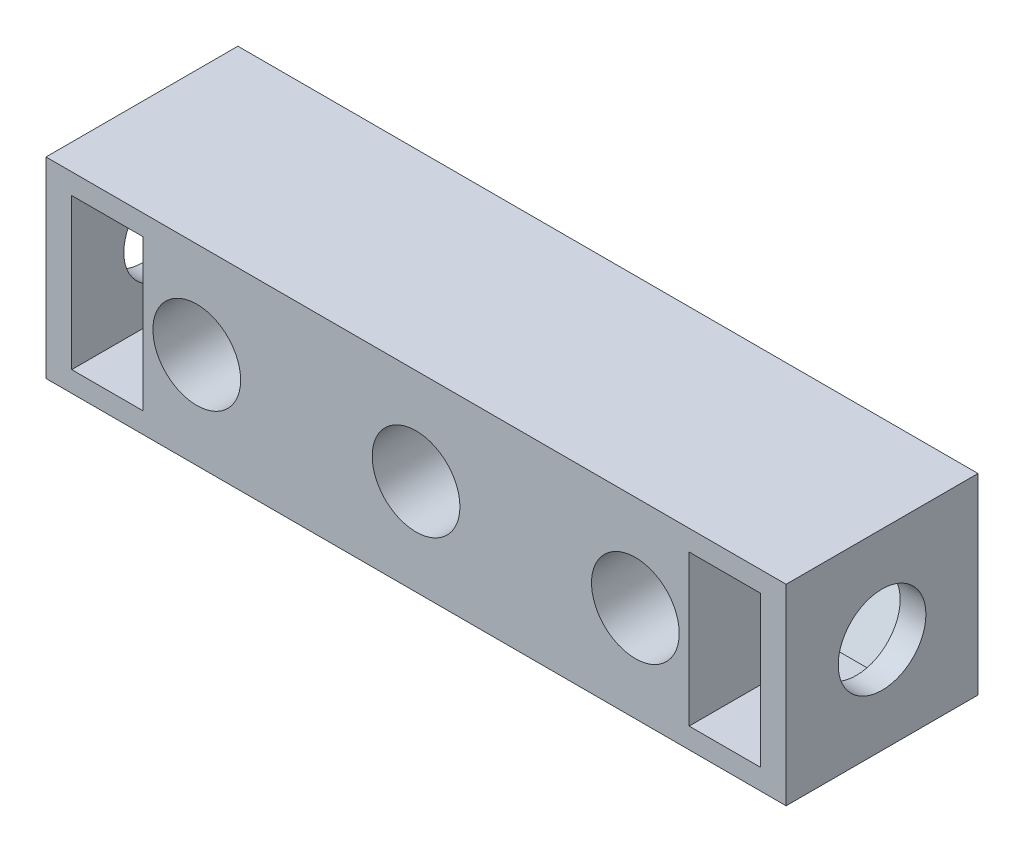
ISO-10303-21;
HEADER;
FILE_DESCRIPTION(('STEP AP214'),'2;1');
FILE_NAME('part.step','',(''),(''),'','','');
FILE_SCHEMA(('AUTOMOTIVE_DESIGN { 1 0 10303 214 1 1 1 1 }'));
ENDSEC;
DATA;
#1=APPLICATION_CONTEXT('core data for automotive mechanical design processes');
#2=APPLICATION_PROTOCOL_DEFINITION('international standard','automotive_design',2000,#1);
#3=PRODUCT_CONTEXT('',#1,'mechanical');
#4=PRODUCT('Part','Part','',(#3));
#5=PRODUCT_RELATED_PRODUCT_CATEGORY('part','',(#4));
#6=PRODUCT_DEFINITION_FORMATION('','',#4);
#7=PRODUCT_DEFINITION_CONTEXT('part definition',#1,'design');
#8=PRODUCT_DEFINITION('design','',#6,#7);
#9=PRODUCT_DEFINITION_SHAPE('','',#8);
#10=(LENGTH_UNIT() NAMED_UNIT(*) SI_UNIT(.MILLI.,.METRE.));
#11=(NAMED_UNIT(*) PLANE_ANGLE_UNIT() SI_UNIT($,.RADIAN.));
#12=(NAMED_UNIT(*) SI_UNIT($,.STERADIAN.) SOLID_ANGLE_UNIT());
#13=UNCERTAINTY_MEASURE_WITH_UNIT(LENGTH_MEASURE(1.E-05),#10,'distance_accuracy_value','');
#14=(GEOMETRIC_REPRESENTATION_CONTEXT(3) GLOBAL_UNCERTAINTY_ASSIGNED_CONTEXT((#13)) GLOBAL_UNIT_ASSIGNED_CONTEXT((#10,
#11,#12)) REPRESENTATION_CONTEXT('',''));
#15=CARTESIAN_POINT('',(0.,0.,0.));
#16=DIRECTION('',(0.,0.,1.));
#17=DIRECTION('',(1.,0.,0.));
#18=AXIS2_PLACEMENT_3D('',#15,#16,#17);
#19=CARTESIAN_POINT('',(0.,0.,7.));
#20=DIRECTION('',(0.,0.,1.));
#21=DIRECTION('',(1.,0.,0.));
#22=AXIS2_PLACEMENT_3D('',#19,#20,#21);
#23=PLANE('',#22);
#24=CARTESIAN_POINT('',(-15.0000000000002,36.2499999999999,7.));
#25=DIRECTION('',(0.,0.,1.));
#26=DIRECTION('',(1.,0.,0.));
#27=AXIS2_PLACEMENT_3D('',#24,#25,#26);
#28=CIRCLE('',#27,1.6);
#29=CARTESIAN_POINT('',(-13.4000000000002,36.2499999999999,7.));
#30=VERTEX_POINT('',#29);
#31=EDGE_CURVE('E225',#30,#30,#28,.T.);
#32=ORIENTED_EDGE('',*,*,#31,.F.);
#33=EDGE_LOOP('',(#32));
#34=FACE_BOUND('',#33,.T.);
#35=CARTESIAN_POINT('',(-23.0000000000002,36.2499999999999,7.));
#36=DIRECTION('',(0.,0.,1.));
#37=DIRECTION('',(1.,0.,0.));
#38=AXIS2_PLACEMENT_3D('',#35,#36,#37);
#39=CIRCLE('',#38,1.6);
#40=CARTESIAN_POINT('',(-21.4000000000002,36.2499999999999,7.));
#41=VERTEX_POINT('',#40);
#42=EDGE_CURVE('E231',#41,#41,#39,.T.);
#43=ORIENTED_EDGE('',*,*,#42,.F.);
#44=EDGE_LOOP('',(#43));
#45=FACE_BOUND('',#44,.T.);
#46=CARTESIAN_POINT('',(-7.00000000000018,36.2499999999999,7.));
#47=DIRECTION('',(0.,0.,1.));
#48=DIRECTION('',(1.,0.,0.));
#49=AXIS2_PLACEMENT_3D('',#46,#47,#48);
#50=CIRCLE('',#49,1.6);
#51=CARTESIAN_POINT('',(-5.40000000000018,36.2499999999999,7.));
#52=VERTEX_POINT('',#51);
#53=EDGE_CURVE('E237',#52,#52,#50,.T.);
#54=ORIENTED_EDGE('',*,*,#53,.F.);
#55=EDGE_LOOP('',(#54));
#56=FACE_BOUND('',#55,.T.);
#57=DIRECTION('',(0.,-1.,0.));
#58=VECTOR('',#57,1.);
#59=CARTESIAN_POINT('',(-28.5000000000001,39.7499999999999,7.));
#60=LINE('',#59,#58);
#61=CARTESIAN_POINT('',(-28.5000000000001,39.7499999999999,7.));
#62=VERTEX_POINT('',#61);
#63=CARTESIAN_POINT('',(-28.5000000000002,32.7499999999999,7.));
#64=VERTEX_POINT('',#63);
#65=EDGE_CURVE('E250',#62,#64,#60,.T.);
#66=ORIENTED_EDGE('',*,*,#65,.T.);
#67=DIRECTION('',(1.,0.,0.));
#68=VECTOR('',#67,1.);
#69=CARTESIAN_POINT('',(-28.5000000000002,32.7499999999999,7.));
#70=LINE('',#69,#68);
#71=CARTESIAN_POINT('',(-1.50000000000015,32.7499999999999,7.));
#72=VERTEX_POINT('',#71);
#73=EDGE_CURVE('E253',#64,#72,#70,.T.);
#74=ORIENTED_EDGE('',*,*,#73,.T.);
#75=DIRECTION('',(0.,-1.,0.));
#76=VECTOR('',#75,1.);
#77=CARTESIAN_POINT('',(-1.50000000000015,39.7499999999999,7.));
#78=LINE('',#77,#76);
#79=CARTESIAN_POINT('',(-1.50000000000015,39.7499999999999,7.));
#80=VERTEX_POINT('',#79);
#81=EDGE_CURVE('E256',#80,#72,#78,.T.);
#82=ORIENTED_EDGE('',*,*,#81,.F.);
#83=DIRECTION('',(1.,0.,0.));
#84=VECTOR('',#83,1.);
#85=CARTESIAN_POINT('',(-28.5000000000001,39.7499999999999,7.));
#86=LINE('',#85,#84);
#87=EDGE_CURVE('E259',#62,#80,#86,.T.);
#88=ORIENTED_EDGE('',*,*,#87,.F.);
#89=EDGE_LOOP('',(#66,#74,#82,#88));
#90=FACE_BOUND('',#89,.T.);
#91=DIRECTION('',(-1.,0.,0.));
#92=VECTOR('',#91,1.);
#93=CARTESIAN_POINT('',(-2.43862300955604,38.9999999999999,7.));
#94=LINE('',#93,#92);
#95=CARTESIAN_POINT('',(-2.43862300955604,38.9999999999999,7.));
#96=VERTEX_POINT('',#95);
#97=CARTESIAN_POINT('',(-5.03862300955604,38.9999999999999,7.));
#98=VERTEX_POINT('',#97);
#99=EDGE_CURVE('E221',#96,#98,#94,.T.);
#100=ORIENTED_EDGE('',*,*,#99,.F.);
#101=DIRECTION('',(0.,1.,0.));
#102=VECTOR('',#101,1.);
#103=CARTESIAN_POINT('',(-2.43862300955604,33.4999999999999,7.));
#104=LINE('',#103,#102);
#105=CARTESIAN_POINT('',(-2.43862300955604,33.4999999999999,7.));
#106=VERTEX_POINT('',#105);
#107=EDGE_CURVE('E202',#106,#96,#104,.T.);
#108=ORIENTED_EDGE('',*,*,#107,.F.);
#109=DIRECTION('',(-1.,0.,0.));
#110=VECTOR('',#109,1.);
#111=CARTESIAN_POINT('',(-2.43862300955604,33.4999999999999,7.));
#112=LINE('',#111,#110);
#113=CARTESIAN_POINT('',(-5.03862300955604,33.4999999999999,7.));
#114=VERTEX_POINT('',#113);
#115=EDGE_CURVE('E213',#106,#114,#112,.T.);
#116=ORIENTED_EDGE('',*,*,#115,.T.);
#117=DIRECTION('',(0.,1.,0.));
#118=VECTOR('',#117,1.);
#119=CARTESIAN_POINT('',(-5.03862300955604,33.4999999999999,7.));
#120=LINE('',#119,#118);
#121=EDGE_CURVE('E189',#114,#98,#120,.T.);
#122=ORIENTED_EDGE('',*,*,#121,.T.);
#123=EDGE_LOOP('',(#100,#108,#116,#122));
#124=FACE_BOUND('',#123,.T.);
#125=DIRECTION('',(1.,0.,0.));
#126=VECTOR('',#125,1.);
#127=CARTESIAN_POINT('',(-27.5613769904442,33.4999999999999,7.));
#128=LINE('',#127,#126);
#129=CARTESIAN_POINT('',(-27.5613769904442,33.4999999999999,7.));
#130=VERTEX_POINT('',#129);
#131=CARTESIAN_POINT('',(-24.9613769904442,33.4999999999999,7.));
#132=VERTEX_POINT('',#131);
#133=EDGE_CURVE('E156',#130,#132,#128,.T.);
#134=ORIENTED_EDGE('',*,*,#133,.F.);
#135=DIRECTION('',(0.,1.,0.));
#136=VECTOR('',#135,1.);
#137=CARTESIAN_POINT('',(-27.5613769904442,33.4999999999999,7.));
#138=LINE('',#137,#136);
#139=CARTESIAN_POINT('',(-27.5613769904442,38.9999999999999,7.));
#140=VERTEX_POINT('',#139);
#141=EDGE_CURVE('E152',#130,#140,#138,.T.);
#142=ORIENTED_EDGE('',*,*,#141,.T.);
#143=DIRECTION('',(1.,0.,0.));
#144=VECTOR('',#143,1.);
#145=CARTESIAN_POINT('',(-27.5613769904442,38.9999999999999,7.));
#146=LINE('',#145,#144);
#147=CARTESIAN_POINT('',(-24.9613769904442,38.9999999999999,7.));
#148=VERTEX_POINT('',#147);
#149=EDGE_CURVE('E180',#140,#148,#146,.T.);
#150=ORIENTED_EDGE('',*,*,#149,.T.);
#151=DIRECTION('',(0.,1.,0.));
#152=VECTOR('',#151,1.);
#153=CARTESIAN_POINT('',(-24.9613769904442,33.4999999999999,7.));
#154=LINE('',#153,#152);
#155=EDGE_CURVE('E168',#132,#148,#154,.T.);
#156=ORIENTED_EDGE('',*,*,#155,.F.);
#157=EDGE_LOOP('',(#134,#142,#150,#156));
#158=FACE_BOUND('',#157,.T.);
#159=ADVANCED_FACE('F35',(#34,#45,#56,#90,#124,#158),#23,.T.);
#160=CARTESIAN_POINT('',(-28.5000000000001,36.2499999999999,3.5));
#161=DIRECTION('',(-1.,0.,0.));
#162=DIRECTION('',(0.,0.,1.));
#163=AXIS2_PLACEMENT_3D('',#160,#161,#162);
#164=CYLINDRICAL_SURFACE('',#163,1.6);
#165=CARTESIAN_POINT('',(-28.5000000000001,36.2499999999999,3.5));
#166=DIRECTION('',(-1.,0.,0.));
#167=DIRECTION('',(0.,0.,1.));
#168=AXIS2_PLACEMENT_3D('',#165,#166,#167);
#169=CIRCLE('',#168,1.6);
#170=CARTESIAN_POINT('',(-28.5000000000001,36.2499999999999,5.1));
#171=VERTEX_POINT('',#170);
#172=EDGE_CURVE('E243',#171,#171,#169,.T.);
#173=ORIENTED_EDGE('',*,*,#172,.T.);
#174=EDGE_LOOP('',(#173));
#175=FACE_BOUND('',#174,.T.);
#176=CARTESIAN_POINT('',(-27.5613769904442,36.2499999999999,3.5));
#177=DIRECTION('',(1.,0.,0.));
#178=DIRECTION('',(0.,1.,0.));
#179=AXIS2_PLACEMENT_3D('',#176,#177,#178);
#180=CIRCLE('',#179,1.6);
#181=CARTESIAN_POINT('',(-27.5613769904442,37.8499999999999,3.5));
#182=VERTEX_POINT('',#181);
#183=EDGE_CURVE('E39',#182,#182,#180,.F.);
#184=ORIENTED_EDGE('',*,*,#183,.F.);
#185=EDGE_LOOP('',(#184));
#186=FACE_BOUND('',#185,.T.);
#187=ADVANCED_FACE('F283',(#175,#186),#164,.F.);
#188=CARTESIAN_POINT('',(-1.50000000000014,36.2499999999999,3.5));
#189=DIRECTION('',(1.,0.,0.));
#190=DIRECTION('',(0.,0.,-1.));
#191=AXIS2_PLACEMENT_3D('',#188,#189,#190);
#192=CYLINDRICAL_SURFACE('',#191,1.6);
#193=CARTESIAN_POINT('',(-1.50000000000014,36.2499999999999,3.5));
#194=DIRECTION('',(1.,0.,0.));
#195=DIRECTION('',(0.,0.,-1.));
#196=AXIS2_PLACEMENT_3D('',#193,#194,#195);
#197=CIRCLE('',#196,1.6);
#198=CARTESIAN_POINT('',(-1.50000000000014,36.2499999999999,1.9));
#199=VERTEX_POINT('',#198);
#200=EDGE_CURVE('E246',#199,#199,#197,.T.);
#201=ORIENTED_EDGE('',*,*,#200,.T.);
#202=EDGE_LOOP('',(#201));
#203=FACE_BOUND('',#202,.T.);
#204=CARTESIAN_POINT('',(-2.43862300955604,36.2499999999999,3.5));
#205=DIRECTION('',(-1.,0.,0.));
#206=DIRECTION('',(0.,0.,1.));
#207=AXIS2_PLACEMENT_3D('',#204,#205,#206);
#208=CIRCLE('',#207,1.6);
#209=CARTESIAN_POINT('',(-2.43862300955604,36.2499999999999,5.1));
#210=VERTEX_POINT('',#209);
#211=EDGE_CURVE('E216',#210,#210,#208,.F.);
#212=ORIENTED_EDGE('',*,*,#211,.F.);
#213=EDGE_LOOP('',(#212));
#214=FACE_BOUND('',#213,.T.);
#215=ADVANCED_FACE('F281',(#203,#214),#192,.F.);
#216=CARTESIAN_POINT('',(-28.5000000000001,39.7499999999999,7.));
#217=DIRECTION('',(1.,0.,0.));
#218=DIRECTION('',(0.,1.,0.));
#219=AXIS2_PLACEMENT_3D('',#216,#217,#218);
#220=PLANE('',#219);
#221=ORIENTED_EDGE('',*,*,#172,.F.);
#222=EDGE_LOOP('',(#221));
#223=FACE_BOUND('',#222,.T.);
#224=DIRECTION('',(0.,-1.,0.));
#225=VECTOR('',#224,1.);
#226=CARTESIAN_POINT('',(-28.5000000000001,39.7499999999999,0.));
#227=LINE('',#226,#225);
#228=CARTESIAN_POINT('',(-28.5000000000001,39.7499999999999,0.));
#229=VERTEX_POINT('',#228);
#230=CARTESIAN_POINT('',(-28.5000000000002,32.7499999999999,0.));
#231=VERTEX_POINT('',#230);
#232=EDGE_CURVE('E249',#229,#231,#227,.T.);
#233=ORIENTED_EDGE('',*,*,#232,.T.);
#234=DIRECTION('',(0.,0.,-1.));
#235=VECTOR('',#234,1.);
#236=CARTESIAN_POINT('',(-28.5000000000002,32.7499999999999,7.));
#237=LINE('',#236,#235);
#238=EDGE_CURVE('E11',#64,#231,#237,.T.);
#239=ORIENTED_EDGE('',*,*,#238,.F.);
#240=ORIENTED_EDGE('',*,*,#65,.F.);
#241=DIRECTION('',(0.,0.,-1.));
#242=VECTOR('',#241,1.);
#243=CARTESIAN_POINT('',(-28.5000000000001,39.7499999999999,7.));
#244=LINE('',#243,#242);
#245=EDGE_CURVE('E262',#62,#229,#244,.T.);
#246=ORIENTED_EDGE('',*,*,#245,.T.);
#247=EDGE_LOOP('',(#233,#239,#240,#246));
#248=FACE_BOUND('',#247,.T.);
#249=ADVANCED_FACE('F37',(#223,#248),#220,.F.);
#250=CARTESIAN_POINT('',(-28.5000000000002,32.7499999999999,7.));
#251=DIRECTION('',(0.,1.,0.));
#252=DIRECTION('',(0.,0.,1.));
#253=AXIS2_PLACEMENT_3D('',#250,#251,#252);
#254=PLANE('',#253);
#255=DIRECTION('',(1.,0.,0.));
#256=VECTOR('',#255,1.);
#257=CARTESIAN_POINT('',(-28.5000000000002,32.7499999999999,0.));
#258=LINE('',#257,#256);
#259=CARTESIAN_POINT('',(-1.50000000000015,32.7499999999999,0.));
#260=VERTEX_POINT('',#259);
#261=EDGE_CURVE('E265',#231,#260,#258,.T.);
#262=ORIENTED_EDGE('',*,*,#261,.T.);
#263=DIRECTION('',(0.,0.,-1.));
#264=VECTOR('',#263,1.);
#265=CARTESIAN_POINT('',(-1.50000000000015,32.7499999999999,7.));
#266=LINE('',#265,#264);
#267=EDGE_CURVE('E44',#72,#260,#266,.T.);
#268=ORIENTED_EDGE('',*,*,#267,.F.);
#269=ORIENTED_EDGE('',*,*,#73,.F.);
#270=ORIENTED_EDGE('',*,*,#238,.T.);
#271=EDGE_LOOP('',(#262,#268,#269,#270));
#272=FACE_BOUND('',#271,.T.);
#273=ADVANCED_FACE('F290',(#272),#254,.F.);
#274=CARTESIAN_POINT('',(-1.50000000000015,39.7499999999999,7.));
#275=DIRECTION('',(1.,0.,0.));
#276=DIRECTION('',(0.,0.,-1.));
#277=AXIS2_PLACEMENT_3D('',#274,#275,#276);
#278=PLANE('',#277);
#279=ORIENTED_EDGE('',*,*,#200,.F.);
#280=EDGE_LOOP('',(#279));
#281=FACE_BOUND('',#280,.T.);
#282=DIRECTION('',(0.,-1.,0.));
#283=VECTOR('',#282,1.);
#284=CARTESIAN_POINT('',(-1.50000000000015,39.7499999999999,0.));
#285=LINE('',#284,#283);
#286=CARTESIAN_POINT('',(-1.50000000000015,39.7499999999999,0.));
#287=VERTEX_POINT('',#286);
#288=EDGE_CURVE('E268',#287,#260,#285,.T.);
#289=ORIENTED_EDGE('',*,*,#288,.F.);
#290=DIRECTION('',(0.,0.,-1.));
#291=VECTOR('',#290,1.);
#292=CARTESIAN_POINT('',(-1.50000000000015,39.7499999999999,7.));
#293=LINE('',#292,#291);
#294=EDGE_CURVE('E274',#80,#287,#293,.T.);
#295=ORIENTED_EDGE('',*,*,#294,.F.);
#296=ORIENTED_EDGE('',*,*,#81,.T.);
#297=ORIENTED_EDGE('',*,*,#267,.T.);
#298=EDGE_LOOP('',(#289,#295,#296,#297));
#299=FACE_BOUND('',#298,.T.);
#300=ADVANCED_FACE('F310',(#281,#299),#278,.T.);
#301=CARTESIAN_POINT('',(-28.5000000000001,39.7499999999999,7.));
#302=DIRECTION('',(0.,1.,0.));
#303=DIRECTION('',(0.,0.,1.));
#304=AXIS2_PLACEMENT_3D('',#301,#302,#303);
#305=PLANE('',#304);
#306=DIRECTION('',(1.,0.,0.));
#307=VECTOR('',#306,1.);
#308=CARTESIAN_POINT('',(-28.5000000000001,39.7499999999999,0.));
#309=LINE('',#308,#307);
#310=EDGE_CURVE('E254',#229,#287,#309,.T.);
#311=ORIENTED_EDGE('',*,*,#310,.F.);
#312=ORIENTED_EDGE('',*,*,#245,.F.);
#313=ORIENTED_EDGE('',*,*,#87,.T.);
#314=ORIENTED_EDGE('',*,*,#294,.T.);
#315=EDGE_LOOP('',(#311,#312,#313,#314));
#316=FACE_BOUND('',#315,.T.);
#317=ADVANCED_FACE('F306',(#316),#305,.T.);
#318=CARTESIAN_POINT('',(0.,0.,0.));
#319=DIRECTION('',(0.,0.,1.));
#320=DIRECTION('',(1.,0.,0.));
#321=AXIS2_PLACEMENT_3D('',#318,#319,#320);
#322=PLANE('',#321);
#323=CARTESIAN_POINT('',(-15.0000000000002,36.2499999999999,0.));
#324=DIRECTION('',(0.,0.,1.));
#325=DIRECTION('',(1.,0.,0.));
#326=AXIS2_PLACEMENT_3D('',#323,#324,#325);
#327=CIRCLE('',#326,1.6);
#328=CARTESIAN_POINT('',(-13.4000000000002,36.2499999999999,0.));
#329=VERTEX_POINT('',#328);
#330=EDGE_CURVE('E228',#329,#329,#327,.T.);
#331=ORIENTED_EDGE('',*,*,#330,.T.);
#332=EDGE_LOOP('',(#331));
#333=FACE_BOUND('',#332,.T.);
#334=CARTESIAN_POINT('',(-23.0000000000002,36.2499999999999,0.));
#335=DIRECTION('',(0.,0.,1.));
#336=DIRECTION('',(1.,0.,0.));
#337=AXIS2_PLACEMENT_3D('',#334,#335,#336);
#338=CIRCLE('',#337,1.6);
#339=CARTESIAN_POINT('',(-21.4000000000002,36.2499999999999,0.));
#340=VERTEX_POINT('',#339);
#341=EDGE_CURVE('E234',#340,#340,#338,.T.);
#342=ORIENTED_EDGE('',*,*,#341,.T.);
#343=EDGE_LOOP('',(#342));
#344=FACE_BOUND('',#343,.T.);
#345=CARTESIAN_POINT('',(-7.00000000000018,36.2499999999999,0.));
#346=DIRECTION('',(0.,0.,1.));
#347=DIRECTION('',(1.,0.,0.));
#348=AXIS2_PLACEMENT_3D('',#345,#346,#347);
#349=CIRCLE('',#348,1.6);
#350=CARTESIAN_POINT('',(-5.40000000000018,36.2499999999999,0.));
#351=VERTEX_POINT('',#350);
#352=EDGE_CURVE('E240',#351,#351,#349,.T.);
#353=ORIENTED_EDGE('',*,*,#352,.T.);
#354=EDGE_LOOP('',(#353));
#355=FACE_BOUND('',#354,.T.);
#356=ORIENTED_EDGE('',*,*,#232,.F.);
#357=ORIENTED_EDGE('',*,*,#310,.T.);
#358=ORIENTED_EDGE('',*,*,#288,.T.);
#359=ORIENTED_EDGE('',*,*,#261,.F.);
#360=EDGE_LOOP('',(#356,#357,#358,#359));
#361=FACE_BOUND('',#360,.T.);
#362=ADVANCED_FACE('F302',(#333,#344,#355,#361),#322,.F.);
#363=CARTESIAN_POINT('',(-7.00000000000018,36.2499999999999,7.));
#364=DIRECTION('',(0.,0.,1.));
#365=DIRECTION('',(1.,0.,0.));
#366=AXIS2_PLACEMENT_3D('',#363,#364,#365);
#367=CYLINDRICAL_SURFACE('',#366,1.6);
#368=ORIENTED_EDGE('',*,*,#352,.F.);
#369=EDGE_LOOP('',(#368));
#370=FACE_BOUND('',#369,.T.);
#371=ORIENTED_EDGE('',*,*,#53,.T.);
#372=EDGE_LOOP('',(#371));
#373=FACE_BOUND('',#372,.T.);
#374=ADVANCED_FACE('F305',(#370,#373),#367,.F.);
#375=CARTESIAN_POINT('',(-23.0000000000002,36.2499999999999,7.));
#376=DIRECTION('',(0.,0.,1.));
#377=DIRECTION('',(1.,0.,0.));
#378=AXIS2_PLACEMENT_3D('',#375,#376,#377);
#379=CYLINDRICAL_SURFACE('',#378,1.6);
#380=ORIENTED_EDGE('',*,*,#341,.F.);
#381=EDGE_LOOP('',(#380));
#382=FACE_BOUND('',#381,.T.);
#383=ORIENTED_EDGE('',*,*,#42,.T.);
#384=EDGE_LOOP('',(#383));
#385=FACE_BOUND('',#384,.T.);
#386=ADVANCED_FACE('F386',(#382,#385),#379,.F.);
#387=CARTESIAN_POINT('',(-15.0000000000002,36.2499999999999,7.));
#388=DIRECTION('',(0.,0.,1.));
#389=DIRECTION('',(1.,0.,0.));
#390=AXIS2_PLACEMENT_3D('',#387,#388,#389);
#391=CYLINDRICAL_SURFACE('',#390,1.6);
#392=ORIENTED_EDGE('',*,*,#330,.F.);
#393=EDGE_LOOP('',(#392));
#394=FACE_BOUND('',#393,.T.);
#395=ORIENTED_EDGE('',*,*,#31,.T.);
#396=EDGE_LOOP('',(#395));
#397=FACE_BOUND('',#396,.T.);
#398=ADVANCED_FACE('F368',(#394,#397),#391,.F.);
#399=CARTESIAN_POINT('',(-2.43862300955604,0.,0.));
#400=DIRECTION('',(-1.,0.,0.));
#401=DIRECTION('',(0.,0.,1.));
#402=AXIS2_PLACEMENT_3D('',#399,#400,#401);
#403=PLANE('',#402);
#404=DIRECTION('',(0.,0.,1.));
#405=VECTOR('',#404,1.);
#406=CARTESIAN_POINT('',(-2.43862300955604,33.4999999999999,5.08771324027146));
#407=LINE('',#406,#405);
#408=CARTESIAN_POINT('',(-2.43862300955604,33.4999999999999,1.91228675972853));
#409=VERTEX_POINT('',#408);
#410=EDGE_CURVE('E199',#409,#106,#407,.T.);
#411=ORIENTED_EDGE('',*,*,#410,.T.);
#412=ORIENTED_EDGE('',*,*,#107,.T.);
#413=DIRECTION('',(0.,0.,-1.));
#414=VECTOR('',#413,1.);
#415=CARTESIAN_POINT('',(-2.43862300955604,38.9999999999999,7.));
#416=LINE('',#415,#414);
#417=CARTESIAN_POINT('',(-2.43862300955604,38.9999999999999,1.91228675972853));
#418=VERTEX_POINT('',#417);
#419=EDGE_CURVE('E205',#96,#418,#416,.T.);
#420=ORIENTED_EDGE('',*,*,#419,.T.);
#421=DIRECTION('',(0.,-0.866025403784438,-0.5));
#422=VECTOR('',#421,1.);
#423=CARTESIAN_POINT('',(-2.43862300955604,38.9999999999999,1.91228675972853));
#424=LINE('',#423,#422);
#425=CARTESIAN_POINT('',(-2.43862300955604,36.2499999999999,0.324573519457054));
#426=VERTEX_POINT('',#425);
#427=EDGE_CURVE('E207',#418,#426,#424,.T.);
#428=ORIENTED_EDGE('',*,*,#427,.T.);
#429=DIRECTION('',(0.,-0.866025403784439,0.5));
#430=VECTOR('',#429,1.);
#431=CARTESIAN_POINT('',(-2.43862300955604,36.2499999999999,0.324573519457054));
#432=LINE('',#431,#430);
#433=EDGE_CURVE('E210',#426,#409,#432,.T.);
#434=ORIENTED_EDGE('',*,*,#433,.T.);
#435=EDGE_LOOP('',(#411,#412,#420,#428,#434));
#436=FACE_BOUND('',#435,.T.);
#437=ORIENTED_EDGE('',*,*,#211,.T.);
#438=EDGE_LOOP('',(#437));
#439=FACE_BOUND('',#438,.T.);
#440=ADVANCED_FACE('F279',(#436,#439),#403,.T.);
#441=CARTESIAN_POINT('',(-2.43862300955604,33.4999999999999,1.91228675972853));
#442=DIRECTION('',(0.,-1.,0.));
#443=DIRECTION('',(0.,0.,-1.));
#444=AXIS2_PLACEMENT_3D('',#441,#442,#443);
#445=PLANE('',#444);
#446=ORIENTED_EDGE('',*,*,#115,.F.);
#447=ORIENTED_EDGE('',*,*,#410,.F.);
#448=DIRECTION('',(-1.,0.,0.));
#449=VECTOR('',#448,1.);
#450=CARTESIAN_POINT('',(-2.43862300955604,33.4999999999999,1.91228675972853));
#451=LINE('',#450,#449);
#452=CARTESIAN_POINT('',(-5.03862300955604,33.4999999999999,1.91228675972853));
#453=VERTEX_POINT('',#452);
#454=EDGE_CURVE('E214',#409,#453,#451,.T.);
#455=ORIENTED_EDGE('',*,*,#454,.T.);
#456=DIRECTION('',(0.,0.,1.));
#457=VECTOR('',#456,1.);
#458=CARTESIAN_POINT('',(-5.03862300955604,33.4999999999999,5.08771324027146));
#459=LINE('',#458,#457);
#460=EDGE_CURVE('E186',#453,#114,#459,.T.);
#461=ORIENTED_EDGE('',*,*,#460,.T.);
#462=EDGE_LOOP('',(#446,#447,#455,#461));
#463=FACE_BOUND('',#462,.T.);
#464=ADVANCED_FACE('F367',(#463),#445,.F.);
#465=CARTESIAN_POINT('',(-2.43862300955604,36.2499999999999,0.324573519457054));
#466=DIRECTION('',(0.,-0.5,-0.866025403784439));
#467=DIRECTION('',(0.,0.866025403784439,-0.5));
#468=AXIS2_PLACEMENT_3D('',#465,#466,#467);
#469=PLANE('',#468);
#470=ORIENTED_EDGE('',*,*,#454,.F.);
#471=ORIENTED_EDGE('',*,*,#433,.F.);
#472=DIRECTION('',(-1.,0.,0.));
#473=VECTOR('',#472,1.);
#474=CARTESIAN_POINT('',(-2.43862300955604,36.2499999999999,0.324573519457054));
#475=LINE('',#474,#473);
#476=CARTESIAN_POINT('',(-5.03862300955604,36.2499999999999,0.324573519457054));
#477=VERTEX_POINT('',#476);
#478=EDGE_CURVE('E217',#426,#477,#475,.T.);
#479=ORIENTED_EDGE('',*,*,#478,.T.);
#480=DIRECTION('',(0.,-0.866025403784439,0.5));
#481=VECTOR('',#480,1.);
#482=CARTESIAN_POINT('',(-5.03862300955604,36.2499999999999,0.324573519457054));
#483=LINE('',#482,#481);
#484=EDGE_CURVE('E196',#477,#453,#483,.T.);
#485=ORIENTED_EDGE('',*,*,#484,.T.);
#486=EDGE_LOOP('',(#470,#471,#479,#485));
#487=FACE_BOUND('',#486,.T.);
#488=ADVANCED_FACE('F372',(#487),#469,.F.);
#489=CARTESIAN_POINT('',(-2.43862300955604,38.9999999999999,1.91228675972853));
#490=DIRECTION('',(0.,0.5,-0.866025403784438));
#491=DIRECTION('',(0.,0.866025403784438,0.5));
#492=AXIS2_PLACEMENT_3D('',#489,#490,#491);
#493=PLANE('',#492);
#494=ORIENTED_EDGE('',*,*,#478,.F.);
#495=ORIENTED_EDGE('',*,*,#427,.F.);
#496=DIRECTION('',(-1.,0.,0.));
#497=VECTOR('',#496,1.);
#498=CARTESIAN_POINT('',(-2.43862300955604,38.9999999999999,1.91228675972853));
#499=LINE('',#498,#497);
#500=CARTESIAN_POINT('',(-5.03862300955604,38.9999999999999,1.91228675972853));
#501=VERTEX_POINT('',#500);
#502=EDGE_CURVE('E219',#418,#501,#499,.T.);
#503=ORIENTED_EDGE('',*,*,#502,.T.);
#504=DIRECTION('',(0.,-0.866025403784438,-0.5));
#505=VECTOR('',#504,1.);
#506=CARTESIAN_POINT('',(-5.03862300955604,38.9999999999999,1.91228675972853));
#507=LINE('',#506,#505);
#508=EDGE_CURVE('E193',#501,#477,#507,.T.);
#509=ORIENTED_EDGE('',*,*,#508,.T.);
#510=EDGE_LOOP('',(#494,#495,#503,#509));
#511=FACE_BOUND('',#510,.T.);
#512=ADVANCED_FACE('F376',(#511),#493,.F.);
#513=CARTESIAN_POINT('',(-2.43862300955604,38.9999999999999,5.08771324027147));
#514=DIRECTION('',(0.,1.,0.));
#515=DIRECTION('',(0.,0.,1.));
#516=AXIS2_PLACEMENT_3D('',#513,#514,#515);
#517=PLANE('',#516);
#518=ORIENTED_EDGE('',*,*,#502,.F.);
#519=ORIENTED_EDGE('',*,*,#419,.F.);
#520=ORIENTED_EDGE('',*,*,#99,.T.);
#521=DIRECTION('',(0.,0.,-1.));
#522=VECTOR('',#521,1.);
#523=CARTESIAN_POINT('',(-5.03862300955604,38.9999999999999,7.));
#524=LINE('',#523,#522);
#525=EDGE_CURVE('E60',#98,#501,#524,.T.);
#526=ORIENTED_EDGE('',*,*,#525,.T.);
#527=EDGE_LOOP('',(#518,#519,#520,#526));
#528=FACE_BOUND('',#527,.T.);
#529=ADVANCED_FACE('F355',(#528),#517,.F.);
#530=CARTESIAN_POINT('',(-5.03862300955604,0.,0.));
#531=DIRECTION('',(-1.,0.,0.));
#532=DIRECTION('',(0.,0.,1.));
#533=AXIS2_PLACEMENT_3D('',#530,#531,#532);
#534=PLANE('',#533);
#535=ORIENTED_EDGE('',*,*,#460,.F.);
#536=ORIENTED_EDGE('',*,*,#484,.F.);
#537=ORIENTED_EDGE('',*,*,#508,.F.);
#538=ORIENTED_EDGE('',*,*,#525,.F.);
#539=ORIENTED_EDGE('',*,*,#121,.F.);
#540=EDGE_LOOP('',(#535,#536,#537,#538,#539));
#541=FACE_BOUND('',#540,.T.);
#542=ADVANCED_FACE('F345',(#541),#534,.F.);
#543=CARTESIAN_POINT('',(-27.5613769904443,0.,0.));
#544=DIRECTION('',(1.,0.,0.));
#545=DIRECTION('',(0.,0.,1.));
#546=AXIS2_PLACEMENT_3D('',#543,#544,#545);
#547=PLANE('',#546);
#548=DIRECTION('',(0.,0.,1.));
#549=VECTOR('',#548,1.);
#550=CARTESIAN_POINT('',(-27.5613769904442,33.4999999999999,5.08771324027146));
#551=LINE('',#550,#549);
#552=CARTESIAN_POINT('',(-27.5613769904442,33.4999999999999,1.91228675972853));
#553=VERTEX_POINT('',#552);
#554=EDGE_CURVE('E170',#553,#130,#551,.T.);
#555=ORIENTED_EDGE('',*,*,#554,.F.);
#556=DIRECTION('',(0.,-0.866025403784439,0.5));
#557=VECTOR('',#556,1.);
#558=CARTESIAN_POINT('',(-27.5613769904442,36.2499999999999,0.324573519457054));
#559=LINE('',#558,#557);
#560=CARTESIAN_POINT('',(-27.5613769904442,36.2499999999999,0.324573519457054));
#561=VERTEX_POINT('',#560);
#562=EDGE_CURVE('E148',#561,#553,#559,.T.);
#563=ORIENTED_EDGE('',*,*,#562,.F.);
#564=DIRECTION('',(0.,-0.866025403784438,-0.5));
#565=VECTOR('',#564,1.);
#566=CARTESIAN_POINT('',(-27.5613769904442,38.9999999999999,1.91228675972853));
#567=LINE('',#566,#565);
#568=CARTESIAN_POINT('',(-27.5613769904442,38.9999999999999,1.91228675972853));
#569=VERTEX_POINT('',#568);
#570=EDGE_CURVE('E173',#569,#561,#567,.T.);
#571=ORIENTED_EDGE('',*,*,#570,.F.);
#572=DIRECTION('',(0.,0.,-1.));
#573=VECTOR('',#572,1.);
#574=CARTESIAN_POINT('',(-27.5613769904442,38.9999999999999,5.08771324027147));
#575=LINE('',#574,#573);
#576=EDGE_CURVE('E175',#140,#569,#575,.T.);
#577=ORIENTED_EDGE('',*,*,#576,.F.);
#578=ORIENTED_EDGE('',*,*,#141,.F.);
#579=EDGE_LOOP('',(#555,#563,#571,#577,#578));
#580=FACE_BOUND('',#579,.T.);
#581=ORIENTED_EDGE('',*,*,#183,.T.);
#582=EDGE_LOOP('',(#581));
#583=FACE_BOUND('',#582,.T.);
#584=ADVANCED_FACE('F342',(#580,#583),#547,.T.);
#585=CARTESIAN_POINT('',(-27.5613769904442,38.9999999999999,7.));
#586=DIRECTION('',(0.,-1.,0.));
#587=DIRECTION('',(1.,0.,0.));
#588=AXIS2_PLACEMENT_3D('',#585,#586,#587);
#589=PLANE('',#588);
#590=ORIENTED_EDGE('',*,*,#149,.F.);
#591=ORIENTED_EDGE('',*,*,#576,.T.);
#592=DIRECTION('',(1.,0.,0.));
#593=VECTOR('',#592,1.);
#594=CARTESIAN_POINT('',(-27.5613769904442,38.9999999999999,1.91228675972853));
#595=LINE('',#594,#593);
#596=CARTESIAN_POINT('',(-24.9613769904442,38.9999999999999,1.91228675972853));
#597=VERTEX_POINT('',#596);
#598=EDGE_CURVE('E183',#569,#597,#595,.T.);
#599=ORIENTED_EDGE('',*,*,#598,.T.);
#600=DIRECTION('',(0.,0.,-1.));
#601=VECTOR('',#600,1.);
#602=CARTESIAN_POINT('',(-24.9613769904442,38.9999999999999,5.08771324027147));
#603=LINE('',#602,#601);
#604=EDGE_CURVE('E164',#148,#597,#603,.T.);
#605=ORIENTED_EDGE('',*,*,#604,.F.);
#606=EDGE_LOOP('',(#590,#591,#599,#605));
#607=FACE_BOUND('',#606,.T.);
#608=ADVANCED_FACE('F336',(#607),#589,.T.);
#609=CARTESIAN_POINT('',(-27.5613769904442,38.9999999999999,1.91228675972853));
#610=DIRECTION('',(0.,-0.5,0.866025403784438));
#611=DIRECTION('',(0.,-0.866025403784438,-0.5));
#612=AXIS2_PLACEMENT_3D('',#609,#610,#611);
#613=PLANE('',#612);
#614=ORIENTED_EDGE('',*,*,#598,.F.);
#615=ORIENTED_EDGE('',*,*,#570,.T.);
#616=DIRECTION('',(1.,0.,0.));
#617=VECTOR('',#616,1.);
#618=CARTESIAN_POINT('',(-27.5613769904442,36.2499999999999,0.324573519457054));
#619=LINE('',#618,#617);
#620=CARTESIAN_POINT('',(-24.9613769904442,36.2499999999999,0.324573519457054));
#621=VERTEX_POINT('',#620);
#622=EDGE_CURVE('E151',#561,#621,#619,.T.);
#623=ORIENTED_EDGE('',*,*,#622,.T.);
#624=DIRECTION('',(0.,-0.866025403784438,-0.5));
#625=VECTOR('',#624,1.);
#626=CARTESIAN_POINT('',(-24.9613769904442,38.9999999999999,1.91228675972853));
#627=LINE('',#626,#625);
#628=EDGE_CURVE('E162',#597,#621,#627,.T.);
#629=ORIENTED_EDGE('',*,*,#628,.F.);
#630=EDGE_LOOP('',(#614,#615,#623,#629));
#631=FACE_BOUND('',#630,.T.);
#632=ADVANCED_FACE('F340',(#631),#613,.T.);
#633=CARTESIAN_POINT('',(-27.5613769904442,36.2499999999999,0.324573519457054));
#634=DIRECTION('',(0.,0.5,0.866025403784439));
#635=DIRECTION('',(0.,-0.866025403784439,0.5));
#636=AXIS2_PLACEMENT_3D('',#633,#634,#635);
#637=PLANE('',#636);
#638=ORIENTED_EDGE('',*,*,#622,.F.);
#639=ORIENTED_EDGE('',*,*,#562,.T.);
#640=DIRECTION('',(1.,0.,0.));
#641=VECTOR('',#640,1.);
#642=CARTESIAN_POINT('',(-27.5613769904442,33.4999999999999,1.91228675972853));
#643=LINE('',#642,#641);
#644=CARTESIAN_POINT('',(-24.9613769904442,33.4999999999999,1.91228675972853));
#645=VERTEX_POINT('',#644);
#646=EDGE_CURVE('E142',#553,#645,#643,.T.);
#647=ORIENTED_EDGE('',*,*,#646,.T.);
#648=DIRECTION('',(0.,-0.866025403784439,0.5));
#649=VECTOR('',#648,1.);
#650=CARTESIAN_POINT('',(-24.9613769904442,36.2499999999999,0.324573519457054));
#651=LINE('',#650,#649);
#652=EDGE_CURVE('E145',#621,#645,#651,.T.);
#653=ORIENTED_EDGE('',*,*,#652,.F.);
#654=EDGE_LOOP('',(#638,#639,#647,#653));
#655=FACE_BOUND('',#654,.T.);
#656=ADVANCED_FACE('F144',(#655),#637,.T.);
#657=CARTESIAN_POINT('',(-27.5613769904442,33.4999999999999,1.91228675972853));
#658=DIRECTION('',(0.,1.,0.));
#659=DIRECTION('',(-1.,0.,0.));
#660=AXIS2_PLACEMENT_3D('',#657,#658,#659);
#661=PLANE('',#660);
#662=ORIENTED_EDGE('',*,*,#646,.F.);
#663=ORIENTED_EDGE('',*,*,#554,.T.);
#664=ORIENTED_EDGE('',*,*,#133,.T.);
#665=DIRECTION('',(0.,0.,1.));
#666=VECTOR('',#665,1.);
#667=CARTESIAN_POINT('',(-24.9613769904442,33.4999999999999,5.08771324027146));
#668=LINE('',#667,#666);
#669=EDGE_CURVE('E52',#645,#132,#668,.T.);
#670=ORIENTED_EDGE('',*,*,#669,.F.);
#671=EDGE_LOOP('',(#662,#663,#664,#670));
#672=FACE_BOUND('',#671,.T.);
#673=ADVANCED_FACE('F154',(#672),#661,.T.);
#674=CARTESIAN_POINT('',(-24.9613769904443,0.,0.));
#675=DIRECTION('',(1.,0.,0.));
#676=DIRECTION('',(0.,0.,1.));
#677=AXIS2_PLACEMENT_3D('',#674,#675,#676);
#678=PLANE('',#677);
#679=ORIENTED_EDGE('',*,*,#669,.T.);
#680=ORIENTED_EDGE('',*,*,#155,.T.);
#681=ORIENTED_EDGE('',*,*,#604,.T.);
#682=ORIENTED_EDGE('',*,*,#628,.T.);
#683=ORIENTED_EDGE('',*,*,#652,.T.);
#684=EDGE_LOOP('',(#679,#680,#681,#682,#683));
#685=FACE_BOUND('',#684,.T.);
#686=ADVANCED_FACE('F159',(#685),#678,.F.);
#687=CLOSED_SHELL('',(#159,#187,#215,#249,#273,#300,#317,#362,#374,#386,#398,#440,#464,#488,
#512,#529,#542,#584,#608,#632,#656,#673,#686));
#688=MANIFOLD_SOLID_BREP('B2',#687);
#689=ADVANCED_BREP_SHAPE_REPRESENTATION('',(#18,#688),#14);
#690=SHAPE_DEFINITION_REPRESENTATION(#9,#689);
ENDSEC;
END-ISO-10303-21;
